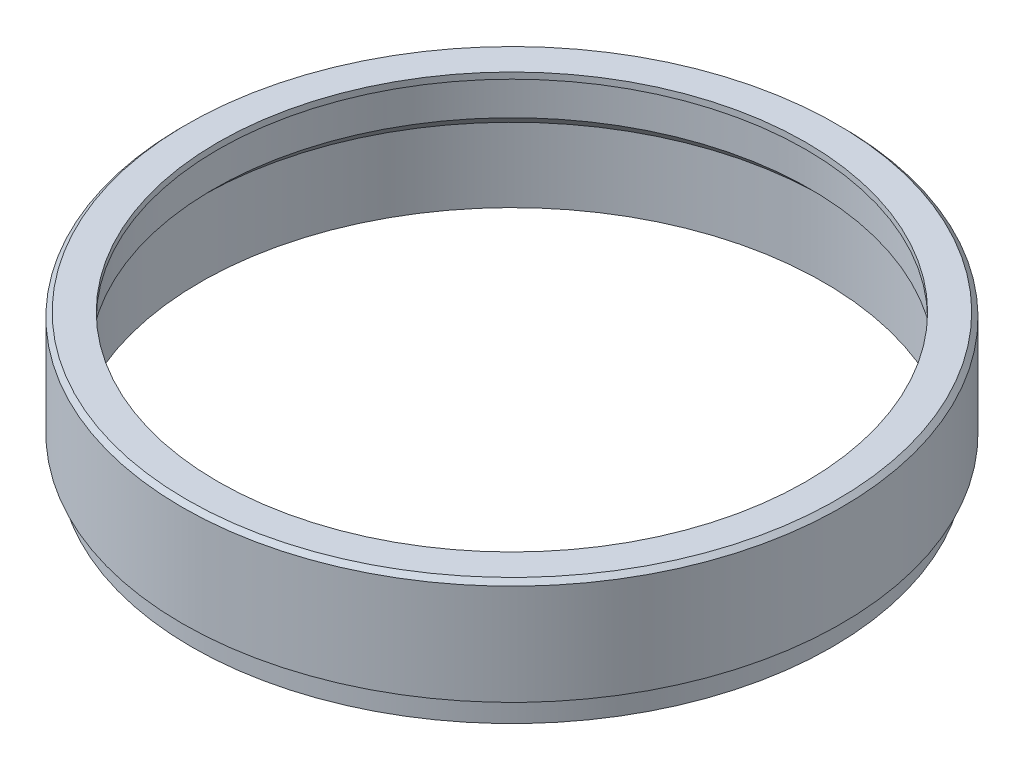
ISO-10303-21;
HEADER;
FILE_DESCRIPTION(('STEP AP214'),'2;1');
FILE_NAME('part.step','',(''),(''),'','','');
FILE_SCHEMA(('AUTOMOTIVE_DESIGN { 1 0 10303 214 1 1 1 1 }'));
ENDSEC;
DATA;
#1=APPLICATION_CONTEXT('core data for automotive mechanical design processes');
#2=APPLICATION_PROTOCOL_DEFINITION('international standard','automotive_design',2000,#1);
#3=PRODUCT_CONTEXT('',#1,'mechanical');
#4=PRODUCT('Part','Part','',(#3));
#5=PRODUCT_RELATED_PRODUCT_CATEGORY('part','',(#4));
#6=PRODUCT_DEFINITION_FORMATION('','',#4);
#7=PRODUCT_DEFINITION_CONTEXT('part definition',#1,'design');
#8=PRODUCT_DEFINITION('design','',#6,#7);
#9=PRODUCT_DEFINITION_SHAPE('','',#8);
#10=(LENGTH_UNIT() NAMED_UNIT(*) SI_UNIT(.MILLI.,.METRE.));
#11=(NAMED_UNIT(*) PLANE_ANGLE_UNIT() SI_UNIT($,.RADIAN.));
#12=(NAMED_UNIT(*) SI_UNIT($,.STERADIAN.) SOLID_ANGLE_UNIT());
#13=UNCERTAINTY_MEASURE_WITH_UNIT(LENGTH_MEASURE(1.E-05),#10,'distance_accuracy_value','');
#14=(GEOMETRIC_REPRESENTATION_CONTEXT(3) GLOBAL_UNCERTAINTY_ASSIGNED_CONTEXT((#13)) GLOBAL_UNIT_ASSIGNED_CONTEXT((#10,
#11,#12)) REPRESENTATION_CONTEXT('',''));
#15=CARTESIAN_POINT('',(0.,0.,0.));
#16=DIRECTION('',(0.,0.,1.));
#17=DIRECTION('',(1.,0.,0.));
#18=AXIS2_PLACEMENT_3D('',#15,#16,#17);
#19=CARTESIAN_POINT('',(-35.95,3.2,0.));
#20=DIRECTION('',(0.,-1.,0.));
#21=DIRECTION('',(0.,0.,-1.));
#22=AXIS2_PLACEMENT_3D('',#19,#20,#21);
#23=PLANE('',#22);
#24=CARTESIAN_POINT('',(0.,3.2,0.));
#25=DIRECTION('',(0.,1.,0.));
#26=DIRECTION('',(0.,0.,1.));
#27=AXIS2_PLACEMENT_3D('',#24,#25,#26);
#28=CIRCLE('',#27,35.);
#29=CARTESIAN_POINT('',(0.,3.2,35.));
#30=VERTEX_POINT('',#29);
#31=EDGE_CURVE('E10',#30,#30,#28,.T.);
#32=ORIENTED_EDGE('',*,*,#31,.T.);
#33=EDGE_LOOP('',(#32));
#34=FACE_BOUND('',#33,.T.);
#35=CARTESIAN_POINT('',(0.,3.2,0.));
#36=DIRECTION('',(0.,1.,0.));
#37=DIRECTION('',(0.,0.,1.));
#38=AXIS2_PLACEMENT_3D('',#35,#36,#37);
#39=CIRCLE('',#38,35.95);
#40=CARTESIAN_POINT('',(0.,3.2,35.95));
#41=VERTEX_POINT('',#40);
#42=EDGE_CURVE('E68',#41,#41,#39,.T.);
#43=ORIENTED_EDGE('',*,*,#42,.F.);
#44=EDGE_LOOP('',(#43));
#45=FACE_BOUND('',#44,.T.);
#46=ADVANCED_FACE('F31',(#34,#45),#23,.T.);
#47=CARTESIAN_POINT('',(0.,0.,0.));
#48=DIRECTION('',(0.,1.,0.));
#49=DIRECTION('',(0.,0.,1.));
#50=AXIS2_PLACEMENT_3D('',#47,#48,#49);
#51=CYLINDRICAL_SURFACE('',#50,35.);
#52=CARTESIAN_POINT('',(0.,11.5,0.));
#53=DIRECTION('',(0.,1.,0.));
#54=DIRECTION('',(0.,0.,1.));
#55=AXIS2_PLACEMENT_3D('',#52,#53,#54);
#56=CIRCLE('',#55,35.);
#57=CARTESIAN_POINT('',(0.,11.5,35.));
#58=VERTEX_POINT('',#57);
#59=EDGE_CURVE('E37',#58,#58,#56,.T.);
#60=ORIENTED_EDGE('',*,*,#59,.T.);
#61=EDGE_LOOP('',(#60));
#62=FACE_BOUND('',#61,.T.);
#63=ORIENTED_EDGE('',*,*,#31,.F.);
#64=EDGE_LOOP('',(#63));
#65=FACE_BOUND('',#64,.T.);
#66=ADVANCED_FACE('F76',(#62,#65),#51,.F.);
#67=CARTESIAN_POINT('',(0.,11.5,0.));
#68=DIRECTION('',(0.,-1.,0.));
#69=DIRECTION('',(0.,0.,-1.));
#70=AXIS2_PLACEMENT_3D('',#67,#68,#69);
#71=CONICAL_SURFACE('',#70,35.,0.785398163397451);
#72=CARTESIAN_POINT('',(0.,13.,0.));
#73=DIRECTION('',(0.,1.,0.));
#74=DIRECTION('',(0.,0.,1.));
#75=AXIS2_PLACEMENT_3D('',#72,#73,#74);
#76=CIRCLE('',#75,33.5);
#77=CARTESIAN_POINT('',(0.,13.,33.5));
#78=VERTEX_POINT('',#77);
#79=EDGE_CURVE('E41',#78,#78,#76,.T.);
#80=ORIENTED_EDGE('',*,*,#79,.T.);
#81=EDGE_LOOP('',(#80));
#82=FACE_BOUND('',#81,.T.);
#83=ORIENTED_EDGE('',*,*,#59,.F.);
#84=EDGE_LOOP('',(#83));
#85=FACE_BOUND('',#84,.T.);
#86=ADVANCED_FACE('F80',(#82,#85),#71,.F.);
#87=CARTESIAN_POINT('',(0.,0.,0.));
#88=DIRECTION('',(0.,1.,0.));
#89=DIRECTION('',(0.,0.,1.));
#90=AXIS2_PLACEMENT_3D('',#87,#88,#89);
#91=CYLINDRICAL_SURFACE('',#90,33.5);
#92=CARTESIAN_POINT('',(0.,17.1,0.));
#93=DIRECTION('',(0.,1.,0.));
#94=DIRECTION('',(0.,0.,1.));
#95=AXIS2_PLACEMENT_3D('',#92,#93,#94);
#96=CIRCLE('',#95,33.5);
#97=CARTESIAN_POINT('',(0.,17.1,33.5));
#98=VERTEX_POINT('',#97);
#99=EDGE_CURVE('E45',#98,#98,#96,.T.);
#100=ORIENTED_EDGE('',*,*,#99,.T.);
#101=EDGE_LOOP('',(#100));
#102=FACE_BOUND('',#101,.T.);
#103=ORIENTED_EDGE('',*,*,#79,.F.);
#104=EDGE_LOOP('',(#103));
#105=FACE_BOUND('',#104,.T.);
#106=ADVANCED_FACE('F84',(#102,#105),#91,.F.);
#107=CARTESIAN_POINT('',(-33.5,17.1,0.));
#108=DIRECTION('',(0.,-1.,0.));
#109=DIRECTION('',(0.,0.,-1.));
#110=AXIS2_PLACEMENT_3D('',#107,#108,#109);
#111=PLANE('',#110);
#112=CARTESIAN_POINT('',(0.,17.1,0.));
#113=DIRECTION('',(0.,1.,0.));
#114=DIRECTION('',(0.,0.,1.));
#115=AXIS2_PLACEMENT_3D('',#112,#113,#114);
#116=CIRCLE('',#115,33.);
#117=CARTESIAN_POINT('',(0.,17.1,33.));
#118=VERTEX_POINT('',#117);
#119=EDGE_CURVE('E50',#118,#118,#116,.T.);
#120=ORIENTED_EDGE('',*,*,#119,.T.);
#121=EDGE_LOOP('',(#120));
#122=FACE_BOUND('',#121,.T.);
#123=ORIENTED_EDGE('',*,*,#99,.F.);
#124=EDGE_LOOP('',(#123));
#125=FACE_BOUND('',#124,.T.);
#126=ADVANCED_FACE('F91',(#122,#125),#111,.T.);
#127=CARTESIAN_POINT('',(0.,0.,0.));
#128=DIRECTION('',(0.,1.,0.));
#129=DIRECTION('',(0.,0.,1.));
#130=AXIS2_PLACEMENT_3D('',#127,#128,#129);
#131=CYLINDRICAL_SURFACE('',#130,33.);
#132=CARTESIAN_POINT('',(0.,17.8,0.));
#133=DIRECTION('',(0.,1.,0.));
#134=DIRECTION('',(0.,0.,1.));
#135=AXIS2_PLACEMENT_3D('',#132,#133,#134);
#136=CIRCLE('',#135,33.);
#137=CARTESIAN_POINT('',(0.,17.8,33.));
#138=VERTEX_POINT('',#137);
#139=EDGE_CURVE('E53',#138,#138,#136,.T.);
#140=ORIENTED_EDGE('',*,*,#139,.T.);
#141=EDGE_LOOP('',(#140));
#142=FACE_BOUND('',#141,.T.);
#143=ORIENTED_EDGE('',*,*,#119,.F.);
#144=EDGE_LOOP('',(#143));
#145=FACE_BOUND('',#144,.T.);
#146=ADVANCED_FACE('F95',(#142,#145),#131,.F.);
#147=CARTESIAN_POINT('',(-33.,17.8,0.));
#148=DIRECTION('',(0.,1.,0.));
#149=DIRECTION('',(0.,0.,1.));
#150=AXIS2_PLACEMENT_3D('',#147,#148,#149);
#151=PLANE('',#150);
#152=CARTESIAN_POINT('',(0.,17.8,0.));
#153=DIRECTION('',(0.,1.,0.));
#154=DIRECTION('',(0.,0.,1.));
#155=AXIS2_PLACEMENT_3D('',#152,#153,#154);
#156=CIRCLE('',#155,36.5);
#157=CARTESIAN_POINT('',(0.,17.8,36.5));
#158=VERTEX_POINT('',#157);
#159=EDGE_CURVE('E56',#158,#158,#156,.T.);
#160=ORIENTED_EDGE('',*,*,#159,.T.);
#161=EDGE_LOOP('',(#160));
#162=FACE_BOUND('',#161,.T.);
#163=ORIENTED_EDGE('',*,*,#139,.F.);
#164=EDGE_LOOP('',(#163));
#165=FACE_BOUND('',#164,.T.);
#166=ADVANCED_FACE('F99',(#162,#165),#151,.T.);
#167=CARTESIAN_POINT('',(0.,17.8,0.));
#168=DIRECTION('',(0.,-1.,0.));
#169=DIRECTION('',(0.,0.,-1.));
#170=AXIS2_PLACEMENT_3D('',#167,#168,#169);
#171=CONICAL_SURFACE('',#170,36.5,0.785398163397448);
#172=CARTESIAN_POINT('',(0.,17.3,0.));
#173=DIRECTION('',(0.,1.,0.));
#174=DIRECTION('',(0.,0.,1.));
#175=AXIS2_PLACEMENT_3D('',#172,#173,#174);
#176=CIRCLE('',#175,37.);
#177=CARTESIAN_POINT('',(0.,17.3,37.));
#178=VERTEX_POINT('',#177);
#179=EDGE_CURVE('E59',#178,#178,#176,.T.);
#180=ORIENTED_EDGE('',*,*,#179,.T.);
#181=EDGE_LOOP('',(#180));
#182=FACE_BOUND('',#181,.T.);
#183=ORIENTED_EDGE('',*,*,#159,.F.);
#184=EDGE_LOOP('',(#183));
#185=FACE_BOUND('',#184,.T.);
#186=ADVANCED_FACE('F103',(#182,#185),#171,.T.);
#187=CARTESIAN_POINT('',(0.,0.,0.));
#188=DIRECTION('',(0.,1.,0.));
#189=DIRECTION('',(0.,0.,1.));
#190=AXIS2_PLACEMENT_3D('',#187,#188,#189);
#191=CYLINDRICAL_SURFACE('',#190,37.);
#192=CARTESIAN_POINT('',(0.,6.,0.));
#193=DIRECTION('',(0.,1.,0.));
#194=DIRECTION('',(0.,0.,1.));
#195=AXIS2_PLACEMENT_3D('',#192,#193,#194);
#196=CIRCLE('',#195,37.);
#197=CARTESIAN_POINT('',(0.,6.,37.));
#198=VERTEX_POINT('',#197);
#199=EDGE_CURVE('E62',#198,#198,#196,.T.);
#200=ORIENTED_EDGE('',*,*,#199,.T.);
#201=EDGE_LOOP('',(#200));
#202=FACE_BOUND('',#201,.T.);
#203=ORIENTED_EDGE('',*,*,#179,.F.);
#204=EDGE_LOOP('',(#203));
#205=FACE_BOUND('',#204,.T.);
#206=ADVANCED_FACE('F107',(#202,#205),#191,.T.);
#207=CARTESIAN_POINT('',(-37.,6.,0.));
#208=DIRECTION('',(0.,-1.,0.));
#209=DIRECTION('',(0.,0.,-1.));
#210=AXIS2_PLACEMENT_3D('',#207,#208,#209);
#211=PLANE('',#210);
#212=CARTESIAN_POINT('',(0.,6.,0.));
#213=DIRECTION('',(0.,1.,0.));
#214=DIRECTION('',(0.,0.,1.));
#215=AXIS2_PLACEMENT_3D('',#212,#213,#214);
#216=CIRCLE('',#215,35.95);
#217=CARTESIAN_POINT('',(0.,6.,35.95));
#218=VERTEX_POINT('',#217);
#219=EDGE_CURVE('E65',#218,#218,#216,.T.);
#220=ORIENTED_EDGE('',*,*,#219,.T.);
#221=EDGE_LOOP('',(#220));
#222=FACE_BOUND('',#221,.T.);
#223=ORIENTED_EDGE('',*,*,#199,.F.);
#224=EDGE_LOOP('',(#223));
#225=FACE_BOUND('',#224,.T.);
#226=ADVANCED_FACE('F111',(#222,#225),#211,.T.);
#227=CARTESIAN_POINT('',(0.,0.,0.));
#228=DIRECTION('',(0.,1.,0.));
#229=DIRECTION('',(0.,0.,1.));
#230=AXIS2_PLACEMENT_3D('',#227,#228,#229);
#231=CYLINDRICAL_SURFACE('',#230,35.95);
#232=ORIENTED_EDGE('',*,*,#42,.T.);
#233=EDGE_LOOP('',(#232));
#234=FACE_BOUND('',#233,.T.);
#235=ORIENTED_EDGE('',*,*,#219,.F.);
#236=EDGE_LOOP('',(#235));
#237=FACE_BOUND('',#236,.T.);
#238=ADVANCED_FACE('F72',(#234,#237),#231,.T.);
#239=CLOSED_SHELL('',(#46,#66,#86,#106,#126,#146,#166,#186,#206,#226,#238));
#240=MANIFOLD_SOLID_BREP('B2',#239);
#241=ADVANCED_BREP_SHAPE_REPRESENTATION('',(#18,#240),#14);
#242=SHAPE_DEFINITION_REPRESENTATION(#9,#241);
ENDSEC;
END-ISO-10303-21;
